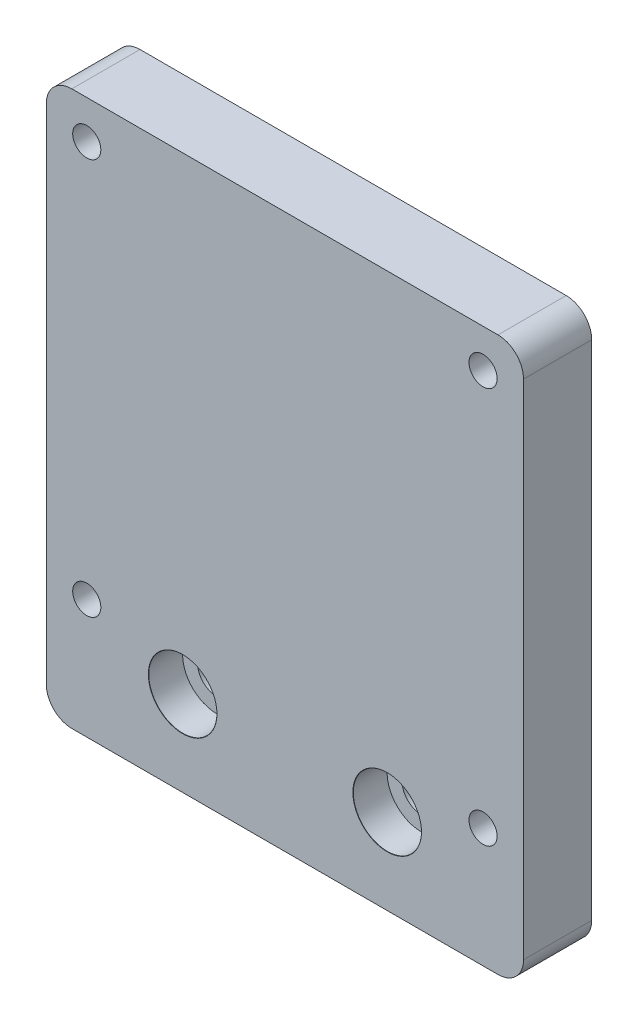
ISO-10303-21;
HEADER;
FILE_DESCRIPTION(('STEP AP214'),'2;1');
FILE_NAME('part.step','',(''),(''),'','','');
FILE_SCHEMA(('AUTOMOTIVE_DESIGN { 1 0 10303 214 1 1 1 1 }'));
ENDSEC;
DATA;
#1=APPLICATION_CONTEXT('core data for automotive mechanical design processes');
#2=APPLICATION_PROTOCOL_DEFINITION('international standard','automotive_design',2000,#1);
#3=PRODUCT_CONTEXT('',#1,'mechanical');
#4=PRODUCT('Part','Part','',(#3));
#5=PRODUCT_RELATED_PRODUCT_CATEGORY('part','',(#4));
#6=PRODUCT_DEFINITION_FORMATION('','',#4);
#7=PRODUCT_DEFINITION_CONTEXT('part definition',#1,'design');
#8=PRODUCT_DEFINITION('design','',#6,#7);
#9=PRODUCT_DEFINITION_SHAPE('','',#8);
#10=(LENGTH_UNIT() NAMED_UNIT(*) SI_UNIT(.MILLI.,.METRE.));
#11=(NAMED_UNIT(*) PLANE_ANGLE_UNIT() SI_UNIT($,.RADIAN.));
#12=(NAMED_UNIT(*) SI_UNIT($,.STERADIAN.) SOLID_ANGLE_UNIT());
#13=UNCERTAINTY_MEASURE_WITH_UNIT(LENGTH_MEASURE(1.E-05),#10,'distance_accuracy_value','');
#14=(GEOMETRIC_REPRESENTATION_CONTEXT(3) GLOBAL_UNCERTAINTY_ASSIGNED_CONTEXT((#13)) GLOBAL_UNIT_ASSIGNED_CONTEXT((#10,
#11,#12)) REPRESENTATION_CONTEXT('',''));
#15=CARTESIAN_POINT('',(0.,0.,0.));
#16=DIRECTION('',(0.,0.,1.));
#17=DIRECTION('',(1.,0.,0.));
#18=AXIS2_PLACEMENT_3D('',#15,#16,#17);
#19=CARTESIAN_POINT('',(28.,-32.5,8.));
#20=DIRECTION('',(-1.,0.,0.));
#21=DIRECTION('',(0.,0.,1.));
#22=AXIS2_PLACEMENT_3D('',#19,#20,#21);
#23=PLANE('',#22);
#24=DIRECTION('',(0.,1.,0.));
#25=VECTOR('',#24,1.);
#26=CARTESIAN_POINT('',(28.,-32.5,8.));
#27=LINE('',#26,#25);
#28=CARTESIAN_POINT('',(28.,-29.5,8.));
#29=VERTEX_POINT('',#28);
#30=CARTESIAN_POINT('',(28.,29.5,8.));
#31=VERTEX_POINT('',#30);
#32=EDGE_CURVE('E125',#29,#31,#27,.T.);
#33=ORIENTED_EDGE('',*,*,#32,.F.);
#34=DIRECTION('',(0.,0.,-1.));
#35=VECTOR('',#34,1.);
#36=CARTESIAN_POINT('',(28.,-29.5,8.));
#37=LINE('',#36,#35);
#38=CARTESIAN_POINT('',(28.,-29.5,0.));
#39=VERTEX_POINT('',#38);
#40=EDGE_CURVE('E110',#29,#39,#37,.T.);
#41=ORIENTED_EDGE('',*,*,#40,.T.);
#42=DIRECTION('',(0.,1.,0.));
#43=VECTOR('',#42,1.);
#44=CARTESIAN_POINT('',(28.,-32.5,0.));
#45=LINE('',#44,#43);
#46=CARTESIAN_POINT('',(28.,29.5,0.));
#47=VERTEX_POINT('',#46);
#48=EDGE_CURVE('E122',#39,#47,#45,.T.);
#49=ORIENTED_EDGE('',*,*,#48,.T.);
#50=DIRECTION('',(0.,0.,-1.));
#51=VECTOR('',#50,1.);
#52=CARTESIAN_POINT('',(28.,29.5,8.));
#53=LINE('',#52,#51);
#54=EDGE_CURVE('E127',#47,#31,#53,.F.);
#55=ORIENTED_EDGE('',*,*,#54,.T.);
#56=EDGE_LOOP('',(#33,#41,#49,#55));
#57=FACE_BOUND('',#56,.T.);
#58=ADVANCED_FACE('F40',(#57),#23,.F.);
#59=CARTESIAN_POINT('',(-28.,32.5,8.));
#60=DIRECTION('',(0.,-1.,0.));
#61=DIRECTION('',(0.,0.,-1.));
#62=AXIS2_PLACEMENT_3D('',#59,#60,#61);
#63=PLANE('',#62);
#64=DIRECTION('',(-1.,0.,0.));
#65=VECTOR('',#64,1.);
#66=CARTESIAN_POINT('',(-28.,32.5,0.));
#67=LINE('',#66,#65);
#68=CARTESIAN_POINT('',(25.,32.5,0.));
#69=VERTEX_POINT('',#68);
#70=CARTESIAN_POINT('',(-25.,32.5,0.));
#71=VERTEX_POINT('',#70);
#72=EDGE_CURVE('E131',#69,#71,#67,.T.);
#73=ORIENTED_EDGE('',*,*,#72,.T.);
#74=DIRECTION('',(0.,0.,-1.));
#75=VECTOR('',#74,1.);
#76=CARTESIAN_POINT('',(-25.,32.5,8.));
#77=LINE('',#76,#75);
#78=CARTESIAN_POINT('',(-25.,32.5,8.));
#79=VERTEX_POINT('',#78);
#80=EDGE_CURVE('E11',#71,#79,#77,.F.);
#81=ORIENTED_EDGE('',*,*,#80,.T.);
#82=DIRECTION('',(-1.,0.,0.));
#83=VECTOR('',#82,1.);
#84=CARTESIAN_POINT('',(-28.,32.5,8.));
#85=LINE('',#84,#83);
#86=CARTESIAN_POINT('',(25.,32.5,8.));
#87=VERTEX_POINT('',#86);
#88=EDGE_CURVE('E171',#87,#79,#85,.T.);
#89=ORIENTED_EDGE('',*,*,#88,.F.);
#90=DIRECTION('',(0.,0.,-1.));
#91=VECTOR('',#90,1.);
#92=CARTESIAN_POINT('',(25.,32.5,8.));
#93=LINE('',#92,#91);
#94=EDGE_CURVE('E48',#87,#69,#93,.T.);
#95=ORIENTED_EDGE('',*,*,#94,.T.);
#96=EDGE_LOOP('',(#73,#81,#89,#95));
#97=FACE_BOUND('',#96,.T.);
#98=ADVANCED_FACE('F169',(#97),#63,.F.);
#99=CARTESIAN_POINT('',(-28.,-32.5,8.));
#100=DIRECTION('',(1.,0.,0.));
#101=DIRECTION('',(0.,0.,-1.));
#102=AXIS2_PLACEMENT_3D('',#99,#100,#101);
#103=PLANE('',#102);
#104=DIRECTION('',(0.,-1.,0.));
#105=VECTOR('',#104,1.);
#106=CARTESIAN_POINT('',(-28.,-32.5,0.));
#107=LINE('',#106,#105);
#108=CARTESIAN_POINT('',(-28.,29.5,0.));
#109=VERTEX_POINT('',#108);
#110=CARTESIAN_POINT('',(-28.,-29.5,0.));
#111=VERTEX_POINT('',#110);
#112=EDGE_CURVE('E135',#109,#111,#107,.T.);
#113=ORIENTED_EDGE('',*,*,#112,.T.);
#114=DIRECTION('',(0.,0.,-1.));
#115=VECTOR('',#114,1.);
#116=CARTESIAN_POINT('',(-28.,-29.5,8.));
#117=LINE('',#116,#115);
#118=CARTESIAN_POINT('',(-28.,-29.5,8.));
#119=VERTEX_POINT('',#118);
#120=EDGE_CURVE('E55',#111,#119,#117,.F.);
#121=ORIENTED_EDGE('',*,*,#120,.T.);
#122=DIRECTION('',(0.,-1.,0.));
#123=VECTOR('',#122,1.);
#124=CARTESIAN_POINT('',(-28.,-32.5,8.));
#125=LINE('',#124,#123);
#126=CARTESIAN_POINT('',(-28.,29.5,8.));
#127=VERTEX_POINT('',#126);
#128=EDGE_CURVE('E179',#127,#119,#125,.T.);
#129=ORIENTED_EDGE('',*,*,#128,.F.);
#130=DIRECTION('',(0.,0.,-1.));
#131=VECTOR('',#130,1.);
#132=CARTESIAN_POINT('',(-28.,29.5,8.));
#133=LINE('',#132,#131);
#134=EDGE_CURVE('E162',#127,#109,#133,.T.);
#135=ORIENTED_EDGE('',*,*,#134,.T.);
#136=EDGE_LOOP('',(#113,#121,#129,#135));
#137=FACE_BOUND('',#136,.T.);
#138=ADVANCED_FACE('F178',(#137),#103,.F.);
#139=CARTESIAN_POINT('',(-28.,-32.5,8.));
#140=DIRECTION('',(0.,1.,0.));
#141=DIRECTION('',(0.,0.,1.));
#142=AXIS2_PLACEMENT_3D('',#139,#140,#141);
#143=PLANE('',#142);
#144=DIRECTION('',(1.,0.,0.));
#145=VECTOR('',#144,1.);
#146=CARTESIAN_POINT('',(-28.,-32.5,0.));
#147=LINE('',#146,#145);
#148=CARTESIAN_POINT('',(-25.,-32.5,0.));
#149=VERTEX_POINT('',#148);
#150=CARTESIAN_POINT('',(25.,-32.5,0.));
#151=VERTEX_POINT('',#150);
#152=EDGE_CURVE('E145',#149,#151,#147,.T.);
#153=ORIENTED_EDGE('',*,*,#152,.T.);
#154=DIRECTION('',(0.,0.,-1.));
#155=VECTOR('',#154,1.);
#156=CARTESIAN_POINT('',(25.,-32.5,8.));
#157=LINE('',#156,#155);
#158=CARTESIAN_POINT('',(25.,-32.5,8.));
#159=VERTEX_POINT('',#158);
#160=EDGE_CURVE('E111',#151,#159,#157,.F.);
#161=ORIENTED_EDGE('',*,*,#160,.T.);
#162=DIRECTION('',(1.,0.,0.));
#163=VECTOR('',#162,1.);
#164=CARTESIAN_POINT('',(-28.,-32.5,8.));
#165=LINE('',#164,#163);
#166=CARTESIAN_POINT('',(-25.,-32.5,8.));
#167=VERTEX_POINT('',#166);
#168=EDGE_CURVE('E141',#167,#159,#165,.T.);
#169=ORIENTED_EDGE('',*,*,#168,.F.);
#170=DIRECTION('',(0.,0.,-1.));
#171=VECTOR('',#170,1.);
#172=CARTESIAN_POINT('',(-25.,-32.5,8.));
#173=LINE('',#172,#171);
#174=EDGE_CURVE('E116',#167,#149,#173,.T.);
#175=ORIENTED_EDGE('',*,*,#174,.T.);
#176=EDGE_LOOP('',(#153,#161,#169,#175));
#177=FACE_BOUND('',#176,.T.);
#178=ADVANCED_FACE('F241',(#177),#143,.F.);
#179=CARTESIAN_POINT('',(0.,0.,8.));
#180=DIRECTION('',(0.,0.,-1.));
#181=DIRECTION('',(-1.,0.,0.));
#182=AXIS2_PLACEMENT_3D('',#179,#180,#181);
#183=PLANE('',#182);
#184=CARTESIAN_POINT('',(-23.25,-18.5,8.));
#185=DIRECTION('',(0.,0.,1.));
#186=DIRECTION('',(1.,0.,0.));
#187=AXIS2_PLACEMENT_3D('',#184,#185,#186);
#188=CIRCLE('',#187,1.64999999999999);
#189=CARTESIAN_POINT('',(-21.6,-18.5,8.));
#190=VERTEX_POINT('',#189);
#191=EDGE_CURVE('E232',#190,#190,#188,.T.);
#192=ORIENTED_EDGE('',*,*,#191,.F.);
#193=EDGE_LOOP('',(#192));
#194=FACE_BOUND('',#193,.T.);
#195=CARTESIAN_POINT('',(23.25,-18.5,8.));
#196=DIRECTION('',(0.,0.,1.));
#197=DIRECTION('',(1.,0.,0.));
#198=AXIS2_PLACEMENT_3D('',#195,#196,#197);
#199=CIRCLE('',#198,1.64999999999999);
#200=CARTESIAN_POINT('',(24.9,-18.5,8.));
#201=VERTEX_POINT('',#200);
#202=EDGE_CURVE('E226',#201,#201,#199,.T.);
#203=ORIENTED_EDGE('',*,*,#202,.F.);
#204=EDGE_LOOP('',(#203));
#205=FACE_BOUND('',#204,.T.);
#206=CARTESIAN_POINT('',(23.25,28.,8.));
#207=DIRECTION('',(0.,0.,1.));
#208=DIRECTION('',(1.,0.,0.));
#209=AXIS2_PLACEMENT_3D('',#206,#207,#208);
#210=CIRCLE('',#209,1.64999999999999);
#211=CARTESIAN_POINT('',(24.9,28.,8.));
#212=VERTEX_POINT('',#211);
#213=EDGE_CURVE('E220',#212,#212,#210,.T.);
#214=ORIENTED_EDGE('',*,*,#213,.F.);
#215=EDGE_LOOP('',(#214));
#216=FACE_BOUND('',#215,.T.);
#217=CARTESIAN_POINT('',(-23.25,28.,8.));
#218=DIRECTION('',(0.,0.,1.));
#219=DIRECTION('',(1.,0.,0.));
#220=AXIS2_PLACEMENT_3D('',#217,#218,#219);
#221=CIRCLE('',#220,1.64999999999999);
#222=CARTESIAN_POINT('',(-21.6,28.,8.));
#223=VERTEX_POINT('',#222);
#224=EDGE_CURVE('E214',#223,#223,#221,.T.);
#225=ORIENTED_EDGE('',*,*,#224,.F.);
#226=EDGE_LOOP('',(#225));
#227=FACE_BOUND('',#226,.T.);
#228=CARTESIAN_POINT('',(-12.,-22.5,8.));
#229=DIRECTION('',(0.,0.,1.));
#230=DIRECTION('',(1.,0.,0.));
#231=AXIS2_PLACEMENT_3D('',#228,#229,#230);
#232=CIRCLE('',#231,4.025);
#233=CARTESIAN_POINT('',(-7.97499999999999,-22.5,8.));
#234=VERTEX_POINT('',#233);
#235=EDGE_CURVE('E208',#234,#234,#232,.T.);
#236=ORIENTED_EDGE('',*,*,#235,.F.);
#237=EDGE_LOOP('',(#236));
#238=FACE_BOUND('',#237,.T.);
#239=CARTESIAN_POINT('',(12.,-22.5,8.));
#240=DIRECTION('',(0.,0.,1.));
#241=DIRECTION('',(1.,0.,0.));
#242=AXIS2_PLACEMENT_3D('',#239,#240,#241);
#243=CIRCLE('',#242,4.025);
#244=CARTESIAN_POINT('',(16.025,-22.5,8.));
#245=VERTEX_POINT('',#244);
#246=EDGE_CURVE('E193',#245,#245,#243,.T.);
#247=ORIENTED_EDGE('',*,*,#246,.F.);
#248=EDGE_LOOP('',(#247));
#249=FACE_BOUND('',#248,.T.);
#250=ORIENTED_EDGE('',*,*,#168,.T.);
#251=CARTESIAN_POINT('',(25.,-29.5,8.));
#252=DIRECTION('',(0.,0.,-1.));
#253=DIRECTION('',(-1.,0.,0.));
#254=AXIS2_PLACEMENT_3D('',#251,#252,#253);
#255=CIRCLE('',#254,3.);
#256=EDGE_CURVE('E160',#159,#29,#255,.F.);
#257=ORIENTED_EDGE('',*,*,#256,.T.);
#258=ORIENTED_EDGE('',*,*,#32,.T.);
#259=CARTESIAN_POINT('',(25.,29.5,8.));
#260=DIRECTION('',(0.,0.,-1.));
#261=DIRECTION('',(-1.,0.,0.));
#262=AXIS2_PLACEMENT_3D('',#259,#260,#261);
#263=CIRCLE('',#262,3.);
#264=EDGE_CURVE('E155',#31,#87,#263,.F.);
#265=ORIENTED_EDGE('',*,*,#264,.T.);
#266=ORIENTED_EDGE('',*,*,#88,.T.);
#267=CARTESIAN_POINT('',(-25.,29.5,8.));
#268=DIRECTION('',(0.,0.,-1.));
#269=DIRECTION('',(-1.,0.,0.));
#270=AXIS2_PLACEMENT_3D('',#267,#268,#269);
#271=CIRCLE('',#270,3.);
#272=EDGE_CURVE('E62',#79,#127,#271,.F.);
#273=ORIENTED_EDGE('',*,*,#272,.T.);
#274=ORIENTED_EDGE('',*,*,#128,.T.);
#275=CARTESIAN_POINT('',(-25.,-29.5,8.));
#276=DIRECTION('',(0.,0.,-1.));
#277=DIRECTION('',(-1.,0.,0.));
#278=AXIS2_PLACEMENT_3D('',#275,#276,#277);
#279=CIRCLE('',#278,3.);
#280=EDGE_CURVE('E158',#119,#167,#279,.F.);
#281=ORIENTED_EDGE('',*,*,#280,.T.);
#282=EDGE_LOOP('',(#250,#257,#258,#265,#266,#273,#274,#281));
#283=FACE_BOUND('',#282,.T.);
#284=ADVANCED_FACE('F238',(#194,#205,#216,#227,#238,#249,#283),#183,.F.);
#285=CARTESIAN_POINT('',(0.,0.,0.));
#286=DIRECTION('',(0.,0.,-1.));
#287=DIRECTION('',(-1.,0.,0.));
#288=AXIS2_PLACEMENT_3D('',#285,#286,#287);
#289=PLANE('',#288);
#290=CARTESIAN_POINT('',(-23.25,-18.5,0.));
#291=DIRECTION('',(0.,0.,-1.));
#292=DIRECTION('',(-1.,0.,0.));
#293=AXIS2_PLACEMENT_3D('',#290,#291,#292);
#294=CIRCLE('',#293,1.64999999999999);
#295=CARTESIAN_POINT('',(-24.9,-18.5,0.));
#296=VERTEX_POINT('',#295);
#297=EDGE_CURVE('E229',#296,#296,#294,.T.);
#298=ORIENTED_EDGE('',*,*,#297,.F.);
#299=EDGE_LOOP('',(#298));
#300=FACE_BOUND('',#299,.T.);
#301=CARTESIAN_POINT('',(23.25,-18.5,0.));
#302=DIRECTION('',(0.,0.,-1.));
#303=DIRECTION('',(-1.,0.,0.));
#304=AXIS2_PLACEMENT_3D('',#301,#302,#303);
#305=CIRCLE('',#304,1.64999999999999);
#306=CARTESIAN_POINT('',(21.6,-18.5,0.));
#307=VERTEX_POINT('',#306);
#308=EDGE_CURVE('E223',#307,#307,#305,.T.);
#309=ORIENTED_EDGE('',*,*,#308,.F.);
#310=EDGE_LOOP('',(#309));
#311=FACE_BOUND('',#310,.T.);
#312=CARTESIAN_POINT('',(23.25,28.,0.));
#313=DIRECTION('',(0.,0.,-1.));
#314=DIRECTION('',(-1.,0.,0.));
#315=AXIS2_PLACEMENT_3D('',#312,#313,#314);
#316=CIRCLE('',#315,1.64999999999999);
#317=CARTESIAN_POINT('',(21.6,28.,0.));
#318=VERTEX_POINT('',#317);
#319=EDGE_CURVE('E217',#318,#318,#316,.T.);
#320=ORIENTED_EDGE('',*,*,#319,.F.);
#321=EDGE_LOOP('',(#320));
#322=FACE_BOUND('',#321,.T.);
#323=CARTESIAN_POINT('',(-23.25,28.,0.));
#324=DIRECTION('',(0.,0.,-1.));
#325=DIRECTION('',(-1.,0.,0.));
#326=AXIS2_PLACEMENT_3D('',#323,#324,#325);
#327=CIRCLE('',#326,1.64999999999999);
#328=CARTESIAN_POINT('',(-24.9,28.,0.));
#329=VERTEX_POINT('',#328);
#330=EDGE_CURVE('E211',#329,#329,#327,.T.);
#331=ORIENTED_EDGE('',*,*,#330,.F.);
#332=EDGE_LOOP('',(#331));
#333=FACE_BOUND('',#332,.T.);
#334=CARTESIAN_POINT('',(-12.,-22.5,0.));
#335=DIRECTION('',(0.,0.,1.));
#336=DIRECTION('',(1.,0.,0.));
#337=AXIS2_PLACEMENT_3D('',#334,#335,#336);
#338=CIRCLE('',#337,2.25);
#339=CARTESIAN_POINT('',(-9.75,-22.5,0.));
#340=VERTEX_POINT('',#339);
#341=EDGE_CURVE('E196',#340,#340,#338,.T.);
#342=ORIENTED_EDGE('',*,*,#341,.T.);
#343=EDGE_LOOP('',(#342));
#344=FACE_BOUND('',#343,.T.);
#345=CARTESIAN_POINT('',(12.,-22.5,0.));
#346=DIRECTION('',(0.,0.,1.));
#347=DIRECTION('',(1.,0.,0.));
#348=AXIS2_PLACEMENT_3D('',#345,#346,#347);
#349=CIRCLE('',#348,2.25);
#350=CARTESIAN_POINT('',(14.25,-22.5,0.));
#351=VERTEX_POINT('',#350);
#352=EDGE_CURVE('E132',#351,#351,#349,.T.);
#353=ORIENTED_EDGE('',*,*,#352,.T.);
#354=EDGE_LOOP('',(#353));
#355=FACE_BOUND('',#354,.T.);
#356=ORIENTED_EDGE('',*,*,#48,.F.);
#357=CARTESIAN_POINT('',(25.,-29.5,0.));
#358=DIRECTION('',(0.,0.,-1.));
#359=DIRECTION('',(-1.,0.,0.));
#360=AXIS2_PLACEMENT_3D('',#357,#358,#359);
#361=CIRCLE('',#360,3.);
#362=EDGE_CURVE('E106',#39,#151,#361,.T.);
#363=ORIENTED_EDGE('',*,*,#362,.T.);
#364=ORIENTED_EDGE('',*,*,#152,.F.);
#365=CARTESIAN_POINT('',(-25.,-29.5,0.));
#366=DIRECTION('',(0.,0.,-1.));
#367=DIRECTION('',(-1.,0.,0.));
#368=AXIS2_PLACEMENT_3D('',#365,#366,#367);
#369=CIRCLE('',#368,3.);
#370=EDGE_CURVE('E117',#149,#111,#369,.T.);
#371=ORIENTED_EDGE('',*,*,#370,.T.);
#372=ORIENTED_EDGE('',*,*,#112,.F.);
#373=CARTESIAN_POINT('',(-25.,29.5,0.));
#374=DIRECTION('',(0.,0.,-1.));
#375=DIRECTION('',(-1.,0.,0.));
#376=AXIS2_PLACEMENT_3D('',#373,#374,#375);
#377=CIRCLE('',#376,3.);
#378=EDGE_CURVE('E149',#109,#71,#377,.T.);
#379=ORIENTED_EDGE('',*,*,#378,.T.);
#380=ORIENTED_EDGE('',*,*,#72,.F.);
#381=CARTESIAN_POINT('',(25.,29.5,0.));
#382=DIRECTION('',(0.,0.,-1.));
#383=DIRECTION('',(-1.,0.,0.));
#384=AXIS2_PLACEMENT_3D('',#381,#382,#383);
#385=CIRCLE('',#384,3.);
#386=EDGE_CURVE('E126',#69,#47,#385,.T.);
#387=ORIENTED_EDGE('',*,*,#386,.T.);
#388=EDGE_LOOP('',(#356,#363,#364,#371,#372,#379,#380,#387));
#389=FACE_BOUND('',#388,.T.);
#390=ADVANCED_FACE('F129',(#300,#311,#322,#333,#344,#355,#389),#289,.T.);
#391=CARTESIAN_POINT('',(25.,-29.5,8.));
#392=DIRECTION('',(0.,0.,-1.));
#393=DIRECTION('',(-1.,0.,0.));
#394=AXIS2_PLACEMENT_3D('',#391,#392,#393);
#395=CYLINDRICAL_SURFACE('',#394,3.);
#396=ORIENTED_EDGE('',*,*,#256,.F.);
#397=ORIENTED_EDGE('',*,*,#160,.F.);
#398=ORIENTED_EDGE('',*,*,#362,.F.);
#399=ORIENTED_EDGE('',*,*,#40,.F.);
#400=EDGE_LOOP('',(#396,#397,#398,#399));
#401=FACE_BOUND('',#400,.T.);
#402=ADVANCED_FACE('F109',(#401),#395,.T.);
#403=CARTESIAN_POINT('',(-25.,-29.5,8.));
#404=DIRECTION('',(0.,0.,-1.));
#405=DIRECTION('',(-1.,0.,0.));
#406=AXIS2_PLACEMENT_3D('',#403,#404,#405);
#407=CYLINDRICAL_SURFACE('',#406,3.);
#408=ORIENTED_EDGE('',*,*,#280,.F.);
#409=ORIENTED_EDGE('',*,*,#120,.F.);
#410=ORIENTED_EDGE('',*,*,#370,.F.);
#411=ORIENTED_EDGE('',*,*,#174,.F.);
#412=EDGE_LOOP('',(#408,#409,#410,#411));
#413=FACE_BOUND('',#412,.T.);
#414=ADVANCED_FACE('F256',(#413),#407,.T.);
#415=CARTESIAN_POINT('',(-25.,29.5,8.));
#416=DIRECTION('',(0.,0.,-1.));
#417=DIRECTION('',(-1.,0.,0.));
#418=AXIS2_PLACEMENT_3D('',#415,#416,#417);
#419=CYLINDRICAL_SURFACE('',#418,3.);
#420=ORIENTED_EDGE('',*,*,#272,.F.);
#421=ORIENTED_EDGE('',*,*,#80,.F.);
#422=ORIENTED_EDGE('',*,*,#378,.F.);
#423=ORIENTED_EDGE('',*,*,#134,.F.);
#424=EDGE_LOOP('',(#420,#421,#422,#423));
#425=FACE_BOUND('',#424,.T.);
#426=ADVANCED_FACE('F177',(#425),#419,.T.);
#427=CARTESIAN_POINT('',(25.,29.5,8.));
#428=DIRECTION('',(0.,0.,-1.));
#429=DIRECTION('',(-1.,0.,0.));
#430=AXIS2_PLACEMENT_3D('',#427,#428,#429);
#431=CYLINDRICAL_SURFACE('',#430,3.);
#432=ORIENTED_EDGE('',*,*,#264,.F.);
#433=ORIENTED_EDGE('',*,*,#54,.F.);
#434=ORIENTED_EDGE('',*,*,#386,.F.);
#435=ORIENTED_EDGE('',*,*,#94,.F.);
#436=EDGE_LOOP('',(#432,#433,#434,#435));
#437=FACE_BOUND('',#436,.T.);
#438=ADVANCED_FACE('F42',(#437),#431,.T.);
#439=CARTESIAN_POINT('',(12.,-22.5,8.));
#440=DIRECTION('',(0.,0.,1.));
#441=DIRECTION('',(1.,0.,0.));
#442=AXIS2_PLACEMENT_3D('',#439,#440,#441);
#443=CYLINDRICAL_SURFACE('',#442,2.25);
#444=ORIENTED_EDGE('',*,*,#352,.F.);
#445=EDGE_LOOP('',(#444));
#446=FACE_BOUND('',#445,.T.);
#447=CARTESIAN_POINT('',(12.,-22.5,4.00000000000001));
#448=DIRECTION('',(0.,0.,1.));
#449=DIRECTION('',(1.,0.,0.));
#450=AXIS2_PLACEMENT_3D('',#447,#448,#449);
#451=CIRCLE('',#450,2.25000000000001);
#452=CARTESIAN_POINT('',(14.25,-22.5,4.00000000000001));
#453=VERTEX_POINT('',#452);
#454=EDGE_CURVE('E138',#453,#453,#451,.T.);
#455=ORIENTED_EDGE('',*,*,#454,.T.);
#456=EDGE_LOOP('',(#455));
#457=FACE_BOUND('',#456,.T.);
#458=ADVANCED_FACE('F278',(#446,#457),#443,.F.);
#459=CARTESIAN_POINT('',(16.,-22.5,4.00000000000001));
#460=DIRECTION('',(0.,0.,-1.));
#461=DIRECTION('',(-1.,0.,0.));
#462=AXIS2_PLACEMENT_3D('',#459,#460,#461);
#463=PLANE('',#462);
#464=ORIENTED_EDGE('',*,*,#454,.F.);
#465=EDGE_LOOP('',(#464));
#466=FACE_BOUND('',#465,.T.);
#467=CARTESIAN_POINT('',(12.,-22.5,4.00000000000001));
#468=DIRECTION('',(0.,0.,1.));
#469=DIRECTION('',(1.,0.,0.));
#470=AXIS2_PLACEMENT_3D('',#467,#468,#469);
#471=CIRCLE('',#470,3.99999999999999);
#472=CARTESIAN_POINT('',(16.,-22.5,4.00000000000001));
#473=VERTEX_POINT('',#472);
#474=EDGE_CURVE('E187',#473,#473,#471,.T.);
#475=ORIENTED_EDGE('',*,*,#474,.T.);
#476=EDGE_LOOP('',(#475));
#477=FACE_BOUND('',#476,.T.);
#478=ADVANCED_FACE('F281',(#466,#477),#463,.F.);
#479=CARTESIAN_POINT('',(12.,-22.5,8.));
#480=DIRECTION('',(0.,0.,1.));
#481=DIRECTION('',(1.,0.,0.));
#482=AXIS2_PLACEMENT_3D('',#479,#480,#481);
#483=CYLINDRICAL_SURFACE('',#482,3.99999999999999);
#484=ORIENTED_EDGE('',*,*,#474,.F.);
#485=EDGE_LOOP('',(#484));
#486=FACE_BOUND('',#485,.T.);
#487=CARTESIAN_POINT('',(12.,-22.5,7.97499999999999));
#488=DIRECTION('',(0.,0.,1.));
#489=DIRECTION('',(1.,0.,0.));
#490=AXIS2_PLACEMENT_3D('',#487,#488,#489);
#491=CIRCLE('',#490,3.99999999999999);
#492=CARTESIAN_POINT('',(16.,-22.5,7.97499999999999));
#493=VERTEX_POINT('',#492);
#494=EDGE_CURVE('E190',#493,#493,#491,.T.);
#495=ORIENTED_EDGE('',*,*,#494,.T.);
#496=EDGE_LOOP('',(#495));
#497=FACE_BOUND('',#496,.T.);
#498=ADVANCED_FACE('F285',(#486,#497),#483,.F.);
#499=CARTESIAN_POINT('',(12.,-22.5,8.));
#500=DIRECTION('',(0.,0.,1.));
#501=DIRECTION('',(1.,0.,0.));
#502=AXIS2_PLACEMENT_3D('',#499,#500,#501);
#503=CONICAL_SURFACE('',#502,4.025,0.785398163397344);
#504=ORIENTED_EDGE('',*,*,#494,.F.);
#505=EDGE_LOOP('',(#504));
#506=FACE_BOUND('',#505,.T.);
#507=ORIENTED_EDGE('',*,*,#246,.T.);
#508=EDGE_LOOP('',(#507));
#509=FACE_BOUND('',#508,.T.);
#510=ADVANCED_FACE('F289',(#506,#509),#503,.F.);
#511=CARTESIAN_POINT('',(-12.,-22.5,8.));
#512=DIRECTION('',(0.,0.,1.));
#513=DIRECTION('',(1.,0.,0.));
#514=AXIS2_PLACEMENT_3D('',#511,#512,#513);
#515=CYLINDRICAL_SURFACE('',#514,2.25);
#516=ORIENTED_EDGE('',*,*,#341,.F.);
#517=EDGE_LOOP('',(#516));
#518=FACE_BOUND('',#517,.T.);
#519=CARTESIAN_POINT('',(-12.,-22.5,4.00000000000001));
#520=DIRECTION('',(0.,0.,1.));
#521=DIRECTION('',(1.,0.,0.));
#522=AXIS2_PLACEMENT_3D('',#519,#520,#521);
#523=CIRCLE('',#522,2.25000000000001);
#524=CARTESIAN_POINT('',(-9.74999999999999,-22.5,4.00000000000001));
#525=VERTEX_POINT('',#524);
#526=EDGE_CURVE('E199',#525,#525,#523,.T.);
#527=ORIENTED_EDGE('',*,*,#526,.T.);
#528=EDGE_LOOP('',(#527));
#529=FACE_BOUND('',#528,.T.);
#530=ADVANCED_FACE('F293',(#518,#529),#515,.F.);
#531=CARTESIAN_POINT('',(-8.,-22.5,4.00000000000001));
#532=DIRECTION('',(0.,0.,-1.));
#533=DIRECTION('',(-1.,0.,0.));
#534=AXIS2_PLACEMENT_3D('',#531,#532,#533);
#535=PLANE('',#534);
#536=ORIENTED_EDGE('',*,*,#526,.F.);
#537=EDGE_LOOP('',(#536));
#538=FACE_BOUND('',#537,.T.);
#539=CARTESIAN_POINT('',(-12.,-22.5,4.00000000000001));
#540=DIRECTION('',(0.,0.,1.));
#541=DIRECTION('',(1.,0.,0.));
#542=AXIS2_PLACEMENT_3D('',#539,#540,#541);
#543=CIRCLE('',#542,3.99999999999999);
#544=CARTESIAN_POINT('',(-8.,-22.5,4.00000000000001));
#545=VERTEX_POINT('',#544);
#546=EDGE_CURVE('E202',#545,#545,#543,.T.);
#547=ORIENTED_EDGE('',*,*,#546,.T.);
#548=EDGE_LOOP('',(#547));
#549=FACE_BOUND('',#548,.T.);
#550=ADVANCED_FACE('F297',(#538,#549),#535,.F.);
#551=CARTESIAN_POINT('',(-12.,-22.5,8.));
#552=DIRECTION('',(0.,0.,1.));
#553=DIRECTION('',(1.,0.,0.));
#554=AXIS2_PLACEMENT_3D('',#551,#552,#553);
#555=CYLINDRICAL_SURFACE('',#554,3.99999999999999);
#556=ORIENTED_EDGE('',*,*,#546,.F.);
#557=EDGE_LOOP('',(#556));
#558=FACE_BOUND('',#557,.T.);
#559=CARTESIAN_POINT('',(-12.,-22.5,7.97499999999999));
#560=DIRECTION('',(0.,0.,1.));
#561=DIRECTION('',(1.,0.,0.));
#562=AXIS2_PLACEMENT_3D('',#559,#560,#561);
#563=CIRCLE('',#562,3.99999999999999);
#564=CARTESIAN_POINT('',(-8.,-22.5,7.97499999999999));
#565=VERTEX_POINT('',#564);
#566=EDGE_CURVE('E205',#565,#565,#563,.T.);
#567=ORIENTED_EDGE('',*,*,#566,.T.);
#568=EDGE_LOOP('',(#567));
#569=FACE_BOUND('',#568,.T.);
#570=ADVANCED_FACE('F301',(#558,#569),#555,.F.);
#571=CARTESIAN_POINT('',(-12.,-22.5,8.));
#572=DIRECTION('',(0.,0.,1.));
#573=DIRECTION('',(1.,0.,0.));
#574=AXIS2_PLACEMENT_3D('',#571,#572,#573);
#575=CONICAL_SURFACE('',#574,4.025,0.785398163397414);
#576=ORIENTED_EDGE('',*,*,#566,.F.);
#577=EDGE_LOOP('',(#576));
#578=FACE_BOUND('',#577,.T.);
#579=ORIENTED_EDGE('',*,*,#235,.T.);
#580=EDGE_LOOP('',(#579));
#581=FACE_BOUND('',#580,.T.);
#582=ADVANCED_FACE('F305',(#578,#581),#575,.F.);
#583=CARTESIAN_POINT('',(-23.25,28.,8.));
#584=DIRECTION('',(0.,0.,1.));
#585=DIRECTION('',(1.,0.,0.));
#586=AXIS2_PLACEMENT_3D('',#583,#584,#585);
#587=CYLINDRICAL_SURFACE('',#586,1.64999999999999);
#588=ORIENTED_EDGE('',*,*,#330,.T.);
#589=EDGE_LOOP('',(#588));
#590=FACE_BOUND('',#589,.T.);
#591=ORIENTED_EDGE('',*,*,#224,.T.);
#592=EDGE_LOOP('',(#591));
#593=FACE_BOUND('',#592,.T.);
#594=ADVANCED_FACE('F309',(#590,#593),#587,.F.);
#595=CARTESIAN_POINT('',(23.25,28.,8.));
#596=DIRECTION('',(0.,0.,1.));
#597=DIRECTION('',(1.,0.,0.));
#598=AXIS2_PLACEMENT_3D('',#595,#596,#597);
#599=CYLINDRICAL_SURFACE('',#598,1.64999999999999);
#600=ORIENTED_EDGE('',*,*,#319,.T.);
#601=EDGE_LOOP('',(#600));
#602=FACE_BOUND('',#601,.T.);
#603=ORIENTED_EDGE('',*,*,#213,.T.);
#604=EDGE_LOOP('',(#603));
#605=FACE_BOUND('',#604,.T.);
#606=ADVANCED_FACE('F313',(#602,#605),#599,.F.);
#607=CARTESIAN_POINT('',(23.25,-18.5,8.));
#608=DIRECTION('',(0.,0.,1.));
#609=DIRECTION('',(1.,0.,0.));
#610=AXIS2_PLACEMENT_3D('',#607,#608,#609);
#611=CYLINDRICAL_SURFACE('',#610,1.64999999999999);
#612=ORIENTED_EDGE('',*,*,#308,.T.);
#613=EDGE_LOOP('',(#612));
#614=FACE_BOUND('',#613,.T.);
#615=ORIENTED_EDGE('',*,*,#202,.T.);
#616=EDGE_LOOP('',(#615));
#617=FACE_BOUND('',#616,.T.);
#618=ADVANCED_FACE('F317',(#614,#617),#611,.F.);
#619=CARTESIAN_POINT('',(-23.25,-18.5,8.));
#620=DIRECTION('',(0.,0.,1.));
#621=DIRECTION('',(1.,0.,0.));
#622=AXIS2_PLACEMENT_3D('',#619,#620,#621);
#623=CYLINDRICAL_SURFACE('',#622,1.64999999999999);
#624=ORIENTED_EDGE('',*,*,#297,.T.);
#625=EDGE_LOOP('',(#624));
#626=FACE_BOUND('',#625,.T.);
#627=ORIENTED_EDGE('',*,*,#191,.T.);
#628=EDGE_LOOP('',(#627));
#629=FACE_BOUND('',#628,.T.);
#630=ADVANCED_FACE('F236',(#626,#629),#623,.F.);
#631=CLOSED_SHELL('',(#58,#98,#138,#178,#284,#390,#402,#414,#426,#438,#458,#478,#498,#510,#530,
#550,#570,#582,#594,#606,#618,#630));
#632=MANIFOLD_SOLID_BREP('B2',#631);
#633=ADVANCED_BREP_SHAPE_REPRESENTATION('',(#18,#632),#14);
#634=SHAPE_DEFINITION_REPRESENTATION(#9,#633);
ENDSEC;
END-ISO-10303-21;
